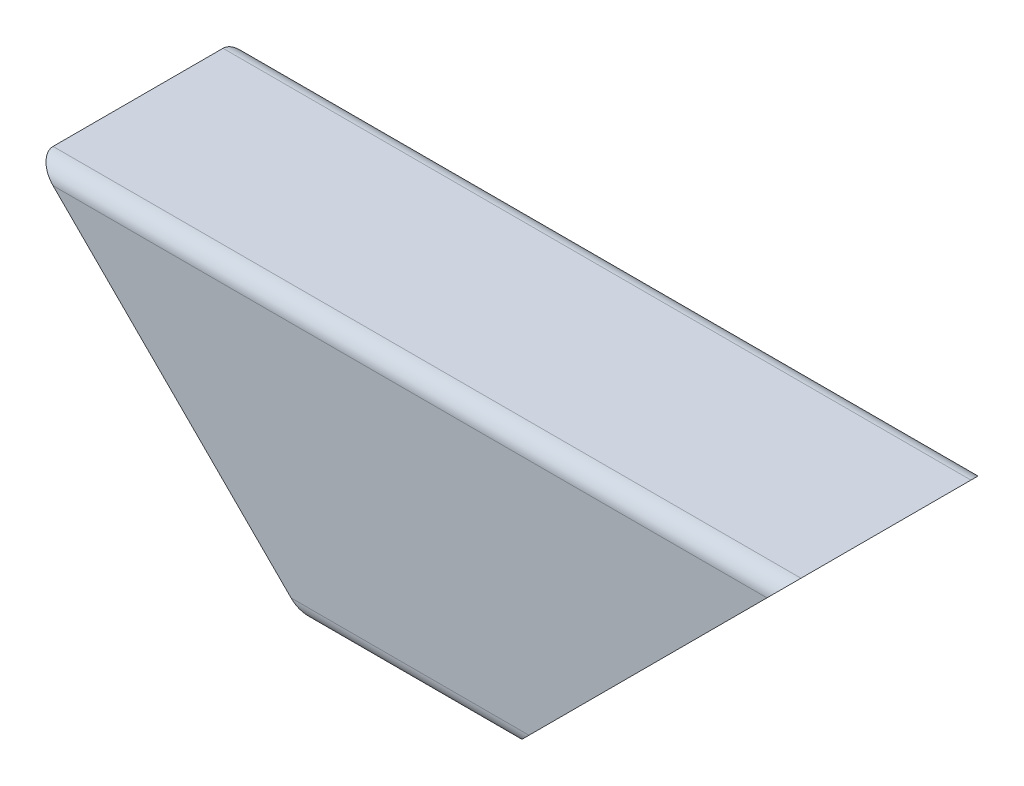
ISO-10303-21;
HEADER;
FILE_DESCRIPTION(('STEP AP214'),'2;1');
FILE_NAME('part.step','',(''),(''),'','','');
FILE_SCHEMA(('AUTOMOTIVE_DESIGN { 1 0 10303 214 1 1 1 1 }'));
ENDSEC;
DATA;
#1=APPLICATION_CONTEXT('core data for automotive mechanical design processes');
#2=APPLICATION_PROTOCOL_DEFINITION('international standard','automotive_design',2000,#1);
#3=PRODUCT_CONTEXT('',#1,'mechanical');
#4=PRODUCT('Part','Part','',(#3));
#5=PRODUCT_RELATED_PRODUCT_CATEGORY('part','',(#4));
#6=PRODUCT_DEFINITION_FORMATION('','',#4);
#7=PRODUCT_DEFINITION_CONTEXT('part definition',#1,'design');
#8=PRODUCT_DEFINITION('design','',#6,#7);
#9=PRODUCT_DEFINITION_SHAPE('','',#8);
#10=(LENGTH_UNIT() NAMED_UNIT(*) SI_UNIT(.MILLI.,.METRE.));
#11=(NAMED_UNIT(*) PLANE_ANGLE_UNIT() SI_UNIT($,.RADIAN.));
#12=(NAMED_UNIT(*) SI_UNIT($,.STERADIAN.) SOLID_ANGLE_UNIT());
#13=UNCERTAINTY_MEASURE_WITH_UNIT(LENGTH_MEASURE(1.E-05),#10,'distance_accuracy_value','');
#14=(GEOMETRIC_REPRESENTATION_CONTEXT(3) GLOBAL_UNCERTAINTY_ASSIGNED_CONTEXT((#13)) GLOBAL_UNIT_ASSIGNED_CONTEXT((#10,
#11,#12)) REPRESENTATION_CONTEXT('',''));
#15=CARTESIAN_POINT('',(0.,0.,0.));
#16=DIRECTION('',(0.,0.,1.));
#17=DIRECTION('',(1.,0.,0.));
#18=AXIS2_PLACEMENT_3D('',#15,#16,#17);
#19=CARTESIAN_POINT('',(139.7,34.2808256510846,71.6854824043168));
#20=DIRECTION('',(-1.,0.,0.));
#21=DIRECTION('',(0.,0.,1.));
#22=AXIS2_PLACEMENT_3D('',#19,#20,#21);
#23=CYLINDRICAL_SURFACE('',#22,3.175);
#24=DIRECTION('',(-1.,0.,0.));
#25=VECTOR('',#24,1.);
#26=CARTESIAN_POINT('',(139.7,34.2808256510845,74.8604824043168));
#27=LINE('',#26,#25);
#28=CARTESIAN_POINT('',(136.525,34.2808256510845,74.8604824043168));
#29=VERTEX_POINT('',#28);
#30=CARTESIAN_POINT('',(3.17499999999998,34.2808256510846,74.8604824043168));
#31=VERTEX_POINT('',#30);
#32=EDGE_CURVE('E215',#29,#31,#27,.T.);
#33=ORIENTED_EDGE('',*,*,#32,.F.);
#34=CARTESIAN_POINT('',(136.525,34.2808256510846,71.6854824043168));
#35=DIRECTION('',(-0.707106781186547,0.707106781186548,0.));
#36=DIRECTION('',(-0.707106781186548,-0.707106781186547,0.));
#37=AXIS2_PLACEMENT_3D('',#34,#35,#36);
#38=ELLIPSE('',#37,4.49012806053457,3.175);
#39=CARTESIAN_POINT('',(139.7,37.4558256510846,71.6854824043168));
#40=VERTEX_POINT('',#39);
#41=EDGE_CURVE('E197',#29,#40,#38,.T.);
#42=ORIENTED_EDGE('',*,*,#41,.T.);
#43=DIRECTION('',(-1.,0.,0.));
#44=VECTOR('',#43,1.);
#45=CARTESIAN_POINT('',(139.7,37.4558256510846,71.6854824043168));
#46=LINE('',#45,#44);
#47=CARTESIAN_POINT('',(0.,37.4558256510846,71.6854824043168));
#48=VERTEX_POINT('',#47);
#49=EDGE_CURVE('E237',#40,#48,#46,.T.);
#50=ORIENTED_EDGE('',*,*,#49,.T.);
#51=CARTESIAN_POINT('',(3.17499999999998,34.2808256510846,71.6854824043168));
#52=DIRECTION('',(0.707106781186547,0.707106781186548,0.));
#53=DIRECTION('',(-0.707106781186548,0.707106781186547,0.));
#54=AXIS2_PLACEMENT_3D('',#51,#52,#53);
#55=ELLIPSE('',#54,4.49012806053457,3.175);
#56=EDGE_CURVE('E221',#48,#31,#55,.T.);
#57=ORIENTED_EDGE('',*,*,#56,.T.);
#58=EDGE_LOOP('',(#33,#42,#50,#57));
#59=FACE_BOUND('',#58,.T.);
#60=ADVANCED_FACE('F85',(#59),#23,.T.);
#61=CARTESIAN_POINT('',(139.7,-10.1691743489154,74.8604824043168));
#62=DIRECTION('',(0.,0.,-1.));
#63=DIRECTION('',(-1.,0.,0.));
#64=AXIS2_PLACEMENT_3D('',#61,#62,#63);
#65=PLANE('',#64);
#66=DIRECTION('',(-1.,0.,0.));
#67=VECTOR('',#66,1.);
#68=CARTESIAN_POINT('',(139.7,-10.1691743489154,74.8604824043168));
#69=LINE('',#68,#67);
#70=CARTESIAN_POINT('',(92.075,-10.1691743489154,74.8604824043168));
#71=VERTEX_POINT('',#70);
#72=CARTESIAN_POINT('',(47.625,-10.1691743489154,74.8604824043168));
#73=VERTEX_POINT('',#72);
#74=EDGE_CURVE('E217',#71,#73,#69,.T.);
#75=ORIENTED_EDGE('',*,*,#74,.F.);
#76=DIRECTION('',(-0.707106781186548,-0.707106781186547,0.));
#77=VECTOR('',#76,1.);
#78=CARTESIAN_POINT('',(139.7,37.4558256510846,74.8604824043168));
#79=LINE('',#78,#77);
#80=EDGE_CURVE('E200',#29,#71,#79,.T.);
#81=ORIENTED_EDGE('',*,*,#80,.F.);
#82=ORIENTED_EDGE('',*,*,#32,.T.);
#83=DIRECTION('',(-0.707106781186548,0.707106781186547,0.));
#84=VECTOR('',#83,1.);
#85=CARTESIAN_POINT('',(76.2,-38.7441743489155,74.8604824043168));
#86=LINE('',#85,#84);
#87=EDGE_CURVE('E208',#73,#31,#86,.T.);
#88=ORIENTED_EDGE('',*,*,#87,.F.);
#89=EDGE_LOOP('',(#75,#81,#82,#88));
#90=FACE_BOUND('',#89,.T.);
#91=ADVANCED_FACE('F213',(#90),#65,.F.);
#92=CARTESIAN_POINT('',(139.7,-10.1691743489154,71.6854824043168));
#93=DIRECTION('',(-1.,0.,0.));
#94=DIRECTION('',(0.,0.,1.));
#95=AXIS2_PLACEMENT_3D('',#92,#93,#94);
#96=CYLINDRICAL_SURFACE('',#95,3.175);
#97=DIRECTION('',(-1.,0.,0.));
#98=VECTOR('',#97,1.);
#99=CARTESIAN_POINT('',(139.7,-13.3441743489154,71.6854824043168));
#100=LINE('',#99,#98);
#101=CARTESIAN_POINT('',(88.9,-13.3441743489154,71.6854824043168));
#102=VERTEX_POINT('',#101);
#103=CARTESIAN_POINT('',(50.8,-13.3441743489154,71.6854824043168));
#104=VERTEX_POINT('',#103);
#105=EDGE_CURVE('E224',#102,#104,#100,.T.);
#106=ORIENTED_EDGE('',*,*,#105,.F.);
#107=CARTESIAN_POINT('',(92.075,-10.1691743489154,71.6854824043168));
#108=DIRECTION('',(-0.707106781186547,0.707106781186548,0.));
#109=DIRECTION('',(-0.707106781186548,-0.707106781186547,0.));
#110=AXIS2_PLACEMENT_3D('',#107,#108,#109);
#111=ELLIPSE('',#110,4.49012806053458,3.175);
#112=EDGE_CURVE('E209',#102,#71,#111,.T.);
#113=ORIENTED_EDGE('',*,*,#112,.T.);
#114=ORIENTED_EDGE('',*,*,#74,.T.);
#115=CARTESIAN_POINT('',(47.625,-10.1691743489154,71.6854824043168));
#116=DIRECTION('',(0.707106781186547,0.707106781186548,0.));
#117=DIRECTION('',(-0.707106781186548,0.707106781186547,0.));
#118=AXIS2_PLACEMENT_3D('',#115,#116,#117);
#119=ELLIPSE('',#118,4.49012806053458,3.175);
#120=EDGE_CURVE('E259',#73,#104,#119,.T.);
#121=ORIENTED_EDGE('',*,*,#120,.T.);
#122=EDGE_LOOP('',(#106,#113,#114,#121));
#123=FACE_BOUND('',#122,.T.);
#124=ADVANCED_FACE('F337',(#123),#96,.T.);
#125=CARTESIAN_POINT('',(139.7,-13.3441743489154,71.6854824043168));
#126=DIRECTION('',(0.,1.,0.));
#127=DIRECTION('',(0.,0.,1.));
#128=AXIS2_PLACEMENT_3D('',#125,#126,#127);
#129=PLANE('',#128);
#130=DIRECTION('',(-1.,0.,0.));
#131=VECTOR('',#130,1.);
#132=CARTESIAN_POINT('',(139.7,-13.3441743489154,39.9354824043168));
#133=LINE('',#132,#131);
#134=CARTESIAN_POINT('',(88.9,-13.3441743489154,39.9354824043168));
#135=VERTEX_POINT('',#134);
#136=CARTESIAN_POINT('',(50.8,-13.3441743489154,39.9354824043168));
#137=VERTEX_POINT('',#136);
#138=EDGE_CURVE('E228',#135,#137,#133,.T.);
#139=ORIENTED_EDGE('',*,*,#138,.F.);
#140=DIRECTION('',(0.,0.,1.));
#141=VECTOR('',#140,1.);
#142=CARTESIAN_POINT('',(88.9,-13.3441743489154,71.6854824043168));
#143=LINE('',#142,#141);
#144=EDGE_CURVE('E296',#135,#102,#143,.T.);
#145=ORIENTED_EDGE('',*,*,#144,.T.);
#146=ORIENTED_EDGE('',*,*,#105,.T.);
#147=DIRECTION('',(0.,0.,-1.));
#148=VECTOR('',#147,1.);
#149=CARTESIAN_POINT('',(50.8,-13.3441743489154,71.6854824043168));
#150=LINE('',#149,#148);
#151=EDGE_CURVE('E262',#104,#137,#150,.T.);
#152=ORIENTED_EDGE('',*,*,#151,.T.);
#153=EDGE_LOOP('',(#139,#145,#146,#152));
#154=FACE_BOUND('',#153,.T.);
#155=ADVANCED_FACE('F334',(#154),#129,.F.);
#156=CARTESIAN_POINT('',(139.7,-10.1691743489154,39.9354824043168));
#157=DIRECTION('',(-1.,0.,0.));
#158=DIRECTION('',(0.,0.,1.));
#159=AXIS2_PLACEMENT_3D('',#156,#157,#158);
#160=CYLINDRICAL_SURFACE('',#159,3.175);
#161=DIRECTION('',(-1.,0.,0.));
#162=VECTOR('',#161,1.);
#163=CARTESIAN_POINT('',(139.7,-10.1691743489154,36.7604824043168));
#164=LINE('',#163,#162);
#165=CARTESIAN_POINT('',(92.075,-10.1691743489154,36.7604824043168));
#166=VERTEX_POINT('',#165);
#167=CARTESIAN_POINT('',(47.625,-10.1691743489154,36.7604824043168));
#168=VERTEX_POINT('',#167);
#169=EDGE_CURVE('E230',#166,#168,#164,.T.);
#170=ORIENTED_EDGE('',*,*,#169,.F.);
#171=CARTESIAN_POINT('',(92.075,-10.1691743489154,39.9354824043168));
#172=DIRECTION('',(-0.707106781186547,0.707106781186548,0.));
#173=DIRECTION('',(-0.707106781186548,-0.707106781186547,0.));
#174=AXIS2_PLACEMENT_3D('',#171,#172,#173);
#175=ELLIPSE('',#174,4.49012806053457,3.175);
#176=EDGE_CURVE('E299',#166,#135,#175,.T.);
#177=ORIENTED_EDGE('',*,*,#176,.T.);
#178=ORIENTED_EDGE('',*,*,#138,.T.);
#179=CARTESIAN_POINT('',(47.625,-10.1691743489154,39.9354824043168));
#180=DIRECTION('',(0.707106781186547,0.707106781186548,0.));
#181=DIRECTION('',(-0.707106781186548,0.707106781186547,0.));
#182=AXIS2_PLACEMENT_3D('',#179,#180,#181);
#183=ELLIPSE('',#182,4.49012806053457,3.175);
#184=EDGE_CURVE('E265',#137,#168,#183,.T.);
#185=ORIENTED_EDGE('',*,*,#184,.T.);
#186=EDGE_LOOP('',(#170,#177,#178,#185));
#187=FACE_BOUND('',#186,.T.);
#188=ADVANCED_FACE('F325',(#187),#160,.T.);
#189=CARTESIAN_POINT('',(139.7,-10.1691743489154,36.7604824043168));
#190=DIRECTION('',(0.,0.,1.));
#191=DIRECTION('',(1.,0.,0.));
#192=AXIS2_PLACEMENT_3D('',#189,#190,#191);
#193=PLANE('',#192);
#194=DIRECTION('',(-1.,0.,0.));
#195=VECTOR('',#194,1.);
#196=CARTESIAN_POINT('',(139.7,34.2808256510845,36.7604824043168));
#197=LINE('',#196,#195);
#198=CARTESIAN_POINT('',(136.525,34.2808256510846,36.7604824043168));
#199=VERTEX_POINT('',#198);
#200=CARTESIAN_POINT('',(3.17499999999998,34.2808256510846,36.7604824043168));
#201=VERTEX_POINT('',#200);
#202=EDGE_CURVE('E232',#199,#201,#197,.T.);
#203=ORIENTED_EDGE('',*,*,#202,.F.);
#204=DIRECTION('',(-0.707106781186548,-0.707106781186547,0.));
#205=VECTOR('',#204,1.);
#206=CARTESIAN_POINT('',(139.7,37.4558256510846,36.7604824043168));
#207=LINE('',#206,#205);
#208=EDGE_CURVE('E218',#199,#166,#207,.T.);
#209=ORIENTED_EDGE('',*,*,#208,.T.);
#210=ORIENTED_EDGE('',*,*,#169,.T.);
#211=DIRECTION('',(-0.707106781186548,0.707106781186547,0.));
#212=VECTOR('',#211,1.);
#213=CARTESIAN_POINT('',(76.2,-38.7441743489155,36.7604824043168));
#214=LINE('',#213,#212);
#215=EDGE_CURVE('E291',#168,#201,#214,.T.);
#216=ORIENTED_EDGE('',*,*,#215,.T.);
#217=EDGE_LOOP('',(#203,#209,#210,#216));
#218=FACE_BOUND('',#217,.T.);
#219=ADVANCED_FACE('F322',(#218),#193,.F.);
#220=CARTESIAN_POINT('',(139.7,34.2808256510846,39.9354824043168));
#221=DIRECTION('',(-1.,0.,0.));
#222=DIRECTION('',(0.,0.,1.));
#223=AXIS2_PLACEMENT_3D('',#220,#221,#222);
#224=CYLINDRICAL_SURFACE('',#223,3.175);
#225=DIRECTION('',(-1.,0.,0.));
#226=VECTOR('',#225,1.);
#227=CARTESIAN_POINT('',(139.7,37.4558256510846,39.9354824043168));
#228=LINE('',#227,#226);
#229=CARTESIAN_POINT('',(139.7,37.4558256510846,39.9354824043168));
#230=VERTEX_POINT('',#229);
#231=CARTESIAN_POINT('',(0.,37.4558256510846,39.9354824043168));
#232=VERTEX_POINT('',#231);
#233=EDGE_CURVE('E234',#230,#232,#228,.T.);
#234=ORIENTED_EDGE('',*,*,#233,.F.);
#235=CARTESIAN_POINT('',(136.525,34.2808256510846,39.9354824043168));
#236=DIRECTION('',(-0.707106781186547,0.707106781186548,0.));
#237=DIRECTION('',(-0.707106781186548,-0.707106781186547,0.));
#238=AXIS2_PLACEMENT_3D('',#235,#236,#237);
#239=ELLIPSE('',#238,4.49012806053457,3.175);
#240=EDGE_CURVE('E302',#230,#199,#239,.T.);
#241=ORIENTED_EDGE('',*,*,#240,.T.);
#242=ORIENTED_EDGE('',*,*,#202,.T.);
#243=CARTESIAN_POINT('',(3.17499999999998,34.2808256510846,39.9354824043168));
#244=DIRECTION('',(0.707106781186547,0.707106781186548,0.));
#245=DIRECTION('',(-0.707106781186548,0.707106781186547,0.));
#246=AXIS2_PLACEMENT_3D('',#243,#244,#245);
#247=ELLIPSE('',#246,4.49012806053457,3.175);
#248=EDGE_CURVE('E268',#201,#232,#247,.T.);
#249=ORIENTED_EDGE('',*,*,#248,.T.);
#250=EDGE_LOOP('',(#234,#241,#242,#249));
#251=FACE_BOUND('',#250,.T.);
#252=ADVANCED_FACE('F342',(#251),#224,.T.);
#253=CARTESIAN_POINT('',(139.7,37.4558256510846,71.6854824043168));
#254=DIRECTION('',(0.,-1.,0.));
#255=DIRECTION('',(0.,0.,-1.));
#256=AXIS2_PLACEMENT_3D('',#253,#254,#255);
#257=PLANE('',#256);
#258=DIRECTION('',(0.,0.,1.));
#259=VECTOR('',#258,1.);
#260=CARTESIAN_POINT('',(0.,37.4558256510846,71.6854824043168));
#261=LINE('',#260,#259);
#262=EDGE_CURVE('E239',#232,#48,#261,.T.);
#263=ORIENTED_EDGE('',*,*,#262,.T.);
#264=ORIENTED_EDGE('',*,*,#49,.F.);
#265=DIRECTION('',(0.,0.,1.));
#266=VECTOR('',#265,1.);
#267=CARTESIAN_POINT('',(139.7,37.4558256510846,71.6854824043168));
#268=LINE('',#267,#266);
#269=EDGE_CURVE('E203',#230,#40,#268,.T.);
#270=ORIENTED_EDGE('',*,*,#269,.F.);
#271=ORIENTED_EDGE('',*,*,#233,.T.);
#272=EDGE_LOOP('',(#263,#264,#270,#271));
#273=FACE_BOUND('',#272,.T.);
#274=ADVANCED_FACE('F339',(#273),#257,.F.);
#275=CARTESIAN_POINT('',(139.7,34.2808256510846,71.6854824043168));
#276=DIRECTION('',(-1.,0.,0.));
#277=DIRECTION('',(0.,0.,1.));
#278=AXIS2_PLACEMENT_3D('',#275,#276,#277);
#279=CYLINDRICAL_SURFACE('',#278,1.524);
#280=CARTESIAN_POINT('',(136.525,34.2808256510846,71.6854824043168));
#281=DIRECTION('',(-0.707106781186547,0.707106781186548,0.));
#282=DIRECTION('',(-0.707106781186548,-0.707106781186547,0.));
#283=AXIS2_PLACEMENT_3D('',#280,#281,#282);
#284=ELLIPSE('',#283,2.15526146905659,1.524);
#285=CARTESIAN_POINT('',(136.525,34.2808256510845,73.2094824043168));
#286=VERTEX_POINT('',#285);
#287=CARTESIAN_POINT('',(138.049,35.8048256510846,71.6854824043168));
#288=VERTEX_POINT('',#287);
#289=EDGE_CURVE('E98',#286,#288,#284,.T.);
#290=ORIENTED_EDGE('',*,*,#289,.F.);
#291=DIRECTION('',(-1.,0.,0.));
#292=VECTOR('',#291,1.);
#293=CARTESIAN_POINT('',(139.7,34.2808256510845,73.2094824043168));
#294=LINE('',#293,#292);
#295=CARTESIAN_POINT('',(3.17500000000004,34.2808256510845,73.2094824043168));
#296=VERTEX_POINT('',#295);
#297=EDGE_CURVE('E242',#286,#296,#294,.T.);
#298=ORIENTED_EDGE('',*,*,#297,.T.);
#299=CARTESIAN_POINT('',(3.17499999999998,34.2808256510846,71.6854824043168));
#300=DIRECTION('',(0.707106781186547,0.707106781186548,0.));
#301=DIRECTION('',(-0.707106781186548,0.707106781186547,0.));
#302=AXIS2_PLACEMENT_3D('',#299,#300,#301);
#303=ELLIPSE('',#302,2.15526146905659,1.524);
#304=CARTESIAN_POINT('',(1.65099999999999,35.8048256510846,71.6854824043168));
#305=VERTEX_POINT('',#304);
#306=EDGE_CURVE('E271',#305,#296,#303,.T.);
#307=ORIENTED_EDGE('',*,*,#306,.F.);
#308=DIRECTION('',(-1.,0.,0.));
#309=VECTOR('',#308,1.);
#310=CARTESIAN_POINT('',(139.7,35.8048256510846,71.6854824043168));
#311=LINE('',#310,#309);
#312=EDGE_CURVE('E256',#288,#305,#311,.T.);
#313=ORIENTED_EDGE('',*,*,#312,.F.);
#314=EDGE_LOOP('',(#290,#298,#307,#313));
#315=FACE_BOUND('',#314,.T.);
#316=ADVANCED_FACE('F349',(#315),#279,.F.);
#317=CARTESIAN_POINT('',(139.7,34.2808256510846,73.2094824043168));
#318=DIRECTION('',(0.,0.,-1.));
#319=DIRECTION('',(-1.,0.,0.));
#320=AXIS2_PLACEMENT_3D('',#317,#318,#319);
#321=PLANE('',#320);
#322=DIRECTION('',(0.707106781186548,0.707106781186547,0.));
#323=VECTOR('',#322,1.);
#324=CARTESIAN_POINT('',(138.1125,35.8683256510846,73.2094824043168));
#325=LINE('',#324,#323);
#326=CARTESIAN_POINT('',(92.075,-10.1691743489154,73.2094824043168));
#327=VERTEX_POINT('',#326);
#328=EDGE_CURVE('E306',#327,#286,#325,.T.);
#329=ORIENTED_EDGE('',*,*,#328,.F.);
#330=DIRECTION('',(-1.,0.,0.));
#331=VECTOR('',#330,1.);
#332=CARTESIAN_POINT('',(139.7,-10.1691743489154,73.2094824043168));
#333=LINE('',#332,#331);
#334=CARTESIAN_POINT('',(47.625,-10.1691743489154,73.2094824043168));
#335=VERTEX_POINT('',#334);
#336=EDGE_CURVE('E245',#327,#335,#333,.T.);
#337=ORIENTED_EDGE('',*,*,#336,.T.);
#338=DIRECTION('',(0.707106781186548,-0.707106781186547,0.));
#339=VECTOR('',#338,1.);
#340=CARTESIAN_POINT('',(71.4375,-33.9816743489154,73.2094824043168));
#341=LINE('',#340,#339);
#342=EDGE_CURVE('E274',#296,#335,#341,.T.);
#343=ORIENTED_EDGE('',*,*,#342,.F.);
#344=ORIENTED_EDGE('',*,*,#297,.F.);
#345=EDGE_LOOP('',(#329,#337,#343,#344));
#346=FACE_BOUND('',#345,.T.);
#347=ADVANCED_FACE('F391',(#346),#321,.T.);
#348=CARTESIAN_POINT('',(139.7,-10.1691743489154,71.6854824043168));
#349=DIRECTION('',(-1.,0.,0.));
#350=DIRECTION('',(0.,0.,1.));
#351=AXIS2_PLACEMENT_3D('',#348,#349,#350);
#352=CYLINDRICAL_SURFACE('',#351,1.524);
#353=CARTESIAN_POINT('',(92.075,-10.1691743489154,71.6854824043168));
#354=DIRECTION('',(-0.707106781186547,0.707106781186548,0.));
#355=DIRECTION('',(-0.707106781186548,-0.707106781186547,0.));
#356=AXIS2_PLACEMENT_3D('',#353,#354,#355);
#357=ELLIPSE('',#356,2.1552614690566,1.524);
#358=CARTESIAN_POINT('',(90.551,-11.6931743489154,71.6854824043168));
#359=VERTEX_POINT('',#358);
#360=EDGE_CURVE('E308',#359,#327,#357,.T.);
#361=ORIENTED_EDGE('',*,*,#360,.F.);
#362=DIRECTION('',(-1.,0.,0.));
#363=VECTOR('',#362,1.);
#364=CARTESIAN_POINT('',(139.7,-11.6931743489154,71.6854824043168));
#365=LINE('',#364,#363);
#366=CARTESIAN_POINT('',(49.149,-11.6931743489154,71.6854824043168));
#367=VERTEX_POINT('',#366);
#368=EDGE_CURVE('E247',#359,#367,#365,.T.);
#369=ORIENTED_EDGE('',*,*,#368,.T.);
#370=CARTESIAN_POINT('',(47.625,-10.1691743489154,71.6854824043168));
#371=DIRECTION('',(0.707106781186547,0.707106781186548,0.));
#372=DIRECTION('',(-0.707106781186548,0.707106781186547,0.));
#373=AXIS2_PLACEMENT_3D('',#370,#371,#372);
#374=ELLIPSE('',#373,2.1552614690566,1.524);
#375=EDGE_CURVE('E277',#335,#367,#374,.T.);
#376=ORIENTED_EDGE('',*,*,#375,.F.);
#377=ORIENTED_EDGE('',*,*,#336,.F.);
#378=EDGE_LOOP('',(#361,#369,#376,#377));
#379=FACE_BOUND('',#378,.T.);
#380=ADVANCED_FACE('F401',(#379),#352,.F.);
#381=CARTESIAN_POINT('',(139.7,-11.6931743489154,71.6854824043168));
#382=DIRECTION('',(0.,1.,0.));
#383=DIRECTION('',(0.,0.,1.));
#384=AXIS2_PLACEMENT_3D('',#381,#382,#383);
#385=PLANE('',#384);
#386=DIRECTION('',(0.,0.,1.));
#387=VECTOR('',#386,1.);
#388=CARTESIAN_POINT('',(90.551,-11.6931743489154,71.6854824043168));
#389=LINE('',#388,#387);
#390=CARTESIAN_POINT('',(90.551,-11.6931743489154,39.9354824043168));
#391=VERTEX_POINT('',#390);
#392=EDGE_CURVE('E310',#391,#359,#389,.T.);
#393=ORIENTED_EDGE('',*,*,#392,.F.);
#394=DIRECTION('',(-1.,0.,0.));
#395=VECTOR('',#394,1.);
#396=CARTESIAN_POINT('',(139.7,-11.6931743489154,39.9354824043168));
#397=LINE('',#396,#395);
#398=CARTESIAN_POINT('',(49.149,-11.6931743489154,39.9354824043168));
#399=VERTEX_POINT('',#398);
#400=EDGE_CURVE('E249',#391,#399,#397,.T.);
#401=ORIENTED_EDGE('',*,*,#400,.T.);
#402=DIRECTION('',(0.,0.,-1.));
#403=VECTOR('',#402,1.);
#404=CARTESIAN_POINT('',(49.149,-11.6931743489154,71.6854824043168));
#405=LINE('',#404,#403);
#406=EDGE_CURVE('E280',#367,#399,#405,.T.);
#407=ORIENTED_EDGE('',*,*,#406,.F.);
#408=ORIENTED_EDGE('',*,*,#368,.F.);
#409=EDGE_LOOP('',(#393,#401,#407,#408));
#410=FACE_BOUND('',#409,.T.);
#411=ADVANCED_FACE('F411',(#410),#385,.T.);
#412=CARTESIAN_POINT('',(139.7,-10.1691743489154,39.9354824043168));
#413=DIRECTION('',(-1.,0.,0.));
#414=DIRECTION('',(0.,0.,1.));
#415=AXIS2_PLACEMENT_3D('',#412,#413,#414);
#416=CYLINDRICAL_SURFACE('',#415,1.524);
#417=CARTESIAN_POINT('',(92.075,-10.1691743489154,39.9354824043168));
#418=DIRECTION('',(-0.707106781186547,0.707106781186548,0.));
#419=DIRECTION('',(-0.707106781186548,-0.707106781186547,0.));
#420=AXIS2_PLACEMENT_3D('',#417,#418,#419);
#421=ELLIPSE('',#420,2.15526146905659,1.524);
#422=CARTESIAN_POINT('',(92.075,-10.1691743489154,38.4114824043168));
#423=VERTEX_POINT('',#422);
#424=EDGE_CURVE('E312',#423,#391,#421,.T.);
#425=ORIENTED_EDGE('',*,*,#424,.F.);
#426=DIRECTION('',(-1.,0.,0.));
#427=VECTOR('',#426,1.);
#428=CARTESIAN_POINT('',(139.7,-10.1691743489154,38.4114824043168));
#429=LINE('',#428,#427);
#430=CARTESIAN_POINT('',(47.625,-10.1691743489154,38.4114824043168));
#431=VERTEX_POINT('',#430);
#432=EDGE_CURVE('E251',#423,#431,#429,.T.);
#433=ORIENTED_EDGE('',*,*,#432,.T.);
#434=CARTESIAN_POINT('',(47.625,-10.1691743489154,39.9354824043168));
#435=DIRECTION('',(0.707106781186547,0.707106781186548,0.));
#436=DIRECTION('',(-0.707106781186548,0.707106781186547,0.));
#437=AXIS2_PLACEMENT_3D('',#434,#435,#436);
#438=ELLIPSE('',#437,2.15526146905659,1.524);
#439=EDGE_CURVE('E283',#399,#431,#438,.T.);
#440=ORIENTED_EDGE('',*,*,#439,.F.);
#441=ORIENTED_EDGE('',*,*,#400,.F.);
#442=EDGE_LOOP('',(#425,#433,#440,#441));
#443=FACE_BOUND('',#442,.T.);
#444=ADVANCED_FACE('F421',(#443),#416,.F.);
#445=CARTESIAN_POINT('',(139.7,34.2808256510846,38.4114824043168));
#446=DIRECTION('',(0.,0.,1.));
#447=DIRECTION('',(1.,0.,0.));
#448=AXIS2_PLACEMENT_3D('',#445,#446,#447);
#449=PLANE('',#448);
#450=DIRECTION('',(-0.707106781186548,-0.707106781186547,0.));
#451=VECTOR('',#450,1.);
#452=CARTESIAN_POINT('',(138.1125,35.8683256510846,38.4114824043168));
#453=LINE('',#452,#451);
#454=CARTESIAN_POINT('',(136.525,34.2808256510845,38.4114824043168));
#455=VERTEX_POINT('',#454);
#456=EDGE_CURVE('E314',#455,#423,#453,.T.);
#457=ORIENTED_EDGE('',*,*,#456,.F.);
#458=DIRECTION('',(-1.,0.,0.));
#459=VECTOR('',#458,1.);
#460=CARTESIAN_POINT('',(139.7,34.2808256510845,38.4114824043168));
#461=LINE('',#460,#459);
#462=CARTESIAN_POINT('',(3.17500000000001,34.2808256510845,38.4114824043168));
#463=VERTEX_POINT('',#462);
#464=EDGE_CURVE('E253',#455,#463,#461,.T.);
#465=ORIENTED_EDGE('',*,*,#464,.T.);
#466=DIRECTION('',(-0.707106781186548,0.707106781186547,0.));
#467=VECTOR('',#466,1.);
#468=CARTESIAN_POINT('',(71.4375,-33.9816743489154,38.4114824043168));
#469=LINE('',#468,#467);
#470=EDGE_CURVE('E286',#431,#463,#469,.T.);
#471=ORIENTED_EDGE('',*,*,#470,.F.);
#472=ORIENTED_EDGE('',*,*,#432,.F.);
#473=EDGE_LOOP('',(#457,#465,#471,#472));
#474=FACE_BOUND('',#473,.T.);
#475=ADVANCED_FACE('F431',(#474),#449,.T.);
#476=CARTESIAN_POINT('',(139.7,34.2808256510846,39.9354824043168));
#477=DIRECTION('',(-1.,0.,0.));
#478=DIRECTION('',(0.,0.,1.));
#479=AXIS2_PLACEMENT_3D('',#476,#477,#478);
#480=CYLINDRICAL_SURFACE('',#479,1.524);
#481=CARTESIAN_POINT('',(136.525,34.2808256510846,39.9354824043168));
#482=DIRECTION('',(-0.707106781186547,0.707106781186548,0.));
#483=DIRECTION('',(-0.707106781186548,-0.707106781186547,0.));
#484=AXIS2_PLACEMENT_3D('',#481,#482,#483);
#485=ELLIPSE('',#484,2.15526146905659,1.524);
#486=CARTESIAN_POINT('',(138.049,35.8048256510846,39.9354824043168));
#487=VERTEX_POINT('',#486);
#488=EDGE_CURVE('E316',#487,#455,#485,.T.);
#489=ORIENTED_EDGE('',*,*,#488,.F.);
#490=DIRECTION('',(-1.,0.,0.));
#491=VECTOR('',#490,1.);
#492=CARTESIAN_POINT('',(139.7,35.8048256510846,39.9354824043168));
#493=LINE('',#492,#491);
#494=CARTESIAN_POINT('',(1.65099999999999,35.8048256510846,39.9354824043168));
#495=VERTEX_POINT('',#494);
#496=EDGE_CURVE('E106',#487,#495,#493,.T.);
#497=ORIENTED_EDGE('',*,*,#496,.T.);
#498=CARTESIAN_POINT('',(3.17499999999998,34.2808256510846,39.9354824043168));
#499=DIRECTION('',(0.707106781186547,0.707106781186548,0.));
#500=DIRECTION('',(-0.707106781186548,0.707106781186547,0.));
#501=AXIS2_PLACEMENT_3D('',#498,#499,#500);
#502=ELLIPSE('',#501,2.15526146905659,1.524);
#503=EDGE_CURVE('E289',#463,#495,#502,.T.);
#504=ORIENTED_EDGE('',*,*,#503,.F.);
#505=ORIENTED_EDGE('',*,*,#464,.F.);
#506=EDGE_LOOP('',(#489,#497,#504,#505));
#507=FACE_BOUND('',#506,.T.);
#508=ADVANCED_FACE('F441',(#507),#480,.F.);
#509=CARTESIAN_POINT('',(139.7,35.8048256510846,71.6854824043168));
#510=DIRECTION('',(0.,-1.,0.));
#511=DIRECTION('',(0.,0.,-1.));
#512=AXIS2_PLACEMENT_3D('',#509,#510,#511);
#513=PLANE('',#512);
#514=DIRECTION('',(0.,0.,-1.));
#515=VECTOR('',#514,1.);
#516=CARTESIAN_POINT('',(138.049,35.8048256510846,71.6854824043168));
#517=LINE('',#516,#515);
#518=EDGE_CURVE('E12',#288,#487,#517,.T.);
#519=ORIENTED_EDGE('',*,*,#518,.F.);
#520=ORIENTED_EDGE('',*,*,#312,.T.);
#521=DIRECTION('',(0.,0.,1.));
#522=VECTOR('',#521,1.);
#523=CARTESIAN_POINT('',(1.65099999999999,35.8048256510846,71.6854824043168));
#524=LINE('',#523,#522);
#525=EDGE_CURVE('E92',#495,#305,#524,.T.);
#526=ORIENTED_EDGE('',*,*,#525,.F.);
#527=ORIENTED_EDGE('',*,*,#496,.F.);
#528=EDGE_LOOP('',(#519,#520,#526,#527));
#529=FACE_BOUND('',#528,.T.);
#530=ADVANCED_FACE('F451',(#529),#513,.T.);
#531=CARTESIAN_POINT('',(76.2,-38.7441743489155,36.7604824043168));
#532=DIRECTION('',(0.707106781186547,0.707106781186548,0.));
#533=DIRECTION('',(-0.707106781186548,0.707106781186547,0.));
#534=AXIS2_PLACEMENT_3D('',#531,#532,#533);
#535=PLANE('',#534);
#536=ORIENTED_EDGE('',*,*,#306,.T.);
#537=ORIENTED_EDGE('',*,*,#342,.T.);
#538=ORIENTED_EDGE('',*,*,#375,.T.);
#539=ORIENTED_EDGE('',*,*,#406,.T.);
#540=ORIENTED_EDGE('',*,*,#439,.T.);
#541=ORIENTED_EDGE('',*,*,#470,.T.);
#542=ORIENTED_EDGE('',*,*,#503,.T.);
#543=ORIENTED_EDGE('',*,*,#525,.T.);
#544=EDGE_LOOP('',(#536,#537,#538,#539,#540,#541,#542,#543));
#545=FACE_BOUND('',#544,.T.);
#546=ORIENTED_EDGE('',*,*,#262,.F.);
#547=ORIENTED_EDGE('',*,*,#248,.F.);
#548=ORIENTED_EDGE('',*,*,#215,.F.);
#549=ORIENTED_EDGE('',*,*,#184,.F.);
#550=ORIENTED_EDGE('',*,*,#151,.F.);
#551=ORIENTED_EDGE('',*,*,#120,.F.);
#552=ORIENTED_EDGE('',*,*,#87,.T.);
#553=ORIENTED_EDGE('',*,*,#56,.F.);
#554=EDGE_LOOP('',(#546,#547,#548,#549,#550,#551,#552,#553));
#555=FACE_BOUND('',#554,.T.);
#556=ADVANCED_FACE('F330',(#545,#555),#535,.F.);
#557=CARTESIAN_POINT('',(139.7,37.4558256510846,36.7604824043168));
#558=DIRECTION('',(-0.707106781186547,0.707106781186548,0.));
#559=DIRECTION('',(-0.707106781186548,-0.707106781186547,0.));
#560=AXIS2_PLACEMENT_3D('',#557,#558,#559);
#561=PLANE('',#560);
#562=ORIENTED_EDGE('',*,*,#289,.T.);
#563=ORIENTED_EDGE('',*,*,#518,.T.);
#564=ORIENTED_EDGE('',*,*,#488,.T.);
#565=ORIENTED_EDGE('',*,*,#456,.T.);
#566=ORIENTED_EDGE('',*,*,#424,.T.);
#567=ORIENTED_EDGE('',*,*,#392,.T.);
#568=ORIENTED_EDGE('',*,*,#360,.T.);
#569=ORIENTED_EDGE('',*,*,#328,.T.);
#570=EDGE_LOOP('',(#562,#563,#564,#565,#566,#567,#568,#569));
#571=FACE_BOUND('',#570,.T.);
#572=ORIENTED_EDGE('',*,*,#80,.T.);
#573=ORIENTED_EDGE('',*,*,#112,.F.);
#574=ORIENTED_EDGE('',*,*,#144,.F.);
#575=ORIENTED_EDGE('',*,*,#176,.F.);
#576=ORIENTED_EDGE('',*,*,#208,.F.);
#577=ORIENTED_EDGE('',*,*,#240,.F.);
#578=ORIENTED_EDGE('',*,*,#269,.T.);
#579=ORIENTED_EDGE('',*,*,#41,.F.);
#580=EDGE_LOOP('',(#572,#573,#574,#575,#576,#577,#578,#579));
#581=FACE_BOUND('',#580,.T.);
#582=ADVANCED_FACE('F199',(#571,#581),#561,.F.);
#583=CLOSED_SHELL('',(#60,#91,#124,#155,#188,#219,#252,#274,#316,#347,#380,#411,#444,#475,#508,
#530,#556,#582));
#584=MANIFOLD_SOLID_BREP('B2',#583);
#585=ADVANCED_BREP_SHAPE_REPRESENTATION('',(#18,#584),#14);
#586=SHAPE_DEFINITION_REPRESENTATION(#9,#585);
ENDSEC;
END-ISO-10303-21;
